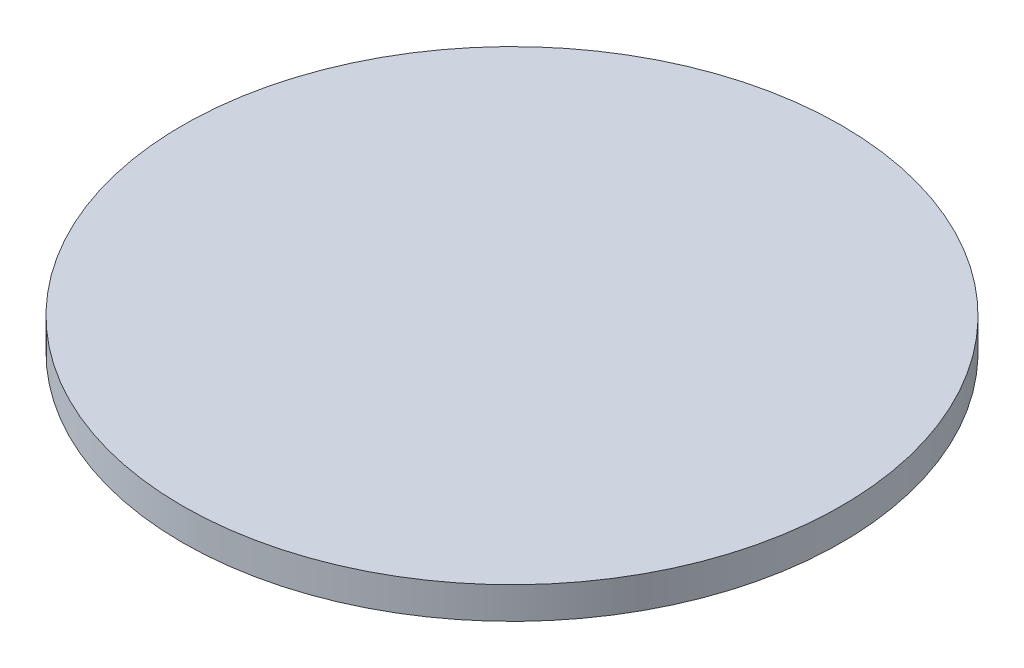
ISO-10303-21;
HEADER;
FILE_DESCRIPTION(('STEP AP214'),'2;1');
FILE_NAME('part.step','',(''),(''),'','','');
FILE_SCHEMA(('AUTOMOTIVE_DESIGN { 1 0 10303 214 1 1 1 1 }'));
ENDSEC;
DATA;
#1=APPLICATION_CONTEXT('core data for automotive mechanical design processes');
#2=APPLICATION_PROTOCOL_DEFINITION('international standard','automotive_design',2000,#1);
#3=PRODUCT_CONTEXT('',#1,'mechanical');
#4=PRODUCT('Part','Part','',(#3));
#5=PRODUCT_RELATED_PRODUCT_CATEGORY('part','',(#4));
#6=PRODUCT_DEFINITION_FORMATION('','',#4);
#7=PRODUCT_DEFINITION_CONTEXT('part definition',#1,'design');
#8=PRODUCT_DEFINITION('design','',#6,#7);
#9=PRODUCT_DEFINITION_SHAPE('','',#8);
#10=(LENGTH_UNIT() NAMED_UNIT(*) SI_UNIT(.MILLI.,.METRE.));
#11=(NAMED_UNIT(*) PLANE_ANGLE_UNIT() SI_UNIT($,.RADIAN.));
#12=(NAMED_UNIT(*) SI_UNIT($,.STERADIAN.) SOLID_ANGLE_UNIT());
#13=UNCERTAINTY_MEASURE_WITH_UNIT(LENGTH_MEASURE(1.E-05),#10,'distance_accuracy_value','');
#14=(GEOMETRIC_REPRESENTATION_CONTEXT(3) GLOBAL_UNCERTAINTY_ASSIGNED_CONTEXT((#13)) GLOBAL_UNIT_ASSIGNED_CONTEXT((#10,
#11,#12)) REPRESENTATION_CONTEXT('',''));
#15=CARTESIAN_POINT('',(0.,0.,0.));
#16=DIRECTION('',(0.,0.,1.));
#17=DIRECTION('',(1.,0.,0.));
#18=AXIS2_PLACEMENT_3D('',#15,#16,#17);
#19=CARTESIAN_POINT('',(0.,1.,0.));
#20=DIRECTION('',(0.,-1.,0.));
#21=DIRECTION('',(0.,0.,-1.));
#22=AXIS2_PLACEMENT_3D('',#19,#20,#21);
#23=CYLINDRICAL_SURFACE('',#22,10.375);
#24=CARTESIAN_POINT('',(0.,1.,0.));
#25=DIRECTION('',(0.,1.,0.));
#26=DIRECTION('',(0.,0.,1.));
#27=AXIS2_PLACEMENT_3D('',#24,#25,#26);
#28=CIRCLE('',#27,10.375);
#29=CARTESIAN_POINT('',(0.,1.,10.375));
#30=VERTEX_POINT('',#29);
#31=EDGE_CURVE('E10',#30,#30,#28,.T.);
#32=ORIENTED_EDGE('',*,*,#31,.F.);
#33=EDGE_LOOP('',(#32));
#34=FACE_BOUND('',#33,.T.);
#35=CARTESIAN_POINT('',(0.,0.,0.));
#36=DIRECTION('',(0.,1.,0.));
#37=DIRECTION('',(0.,0.,1.));
#38=AXIS2_PLACEMENT_3D('',#35,#36,#37);
#39=CIRCLE('',#38,10.375);
#40=CARTESIAN_POINT('',(0.,0.,10.375));
#41=VERTEX_POINT('',#40);
#42=EDGE_CURVE('E40',#41,#41,#39,.T.);
#43=ORIENTED_EDGE('',*,*,#42,.T.);
#44=EDGE_LOOP('',(#43));
#45=FACE_BOUND('',#44,.T.);
#46=ADVANCED_FACE('F37',(#34,#45),#23,.T.);
#47=CARTESIAN_POINT('',(0.,1.,0.));
#48=DIRECTION('',(0.,1.,0.));
#49=DIRECTION('',(0.,0.,1.));
#50=AXIS2_PLACEMENT_3D('',#47,#48,#49);
#51=PLANE('',#50);
#52=ORIENTED_EDGE('',*,*,#31,.T.);
#53=EDGE_LOOP('',(#52));
#54=FACE_BOUND('',#53,.T.);
#55=ADVANCED_FACE('F54',(#54),#51,.T.);
#56=CARTESIAN_POINT('',(0.,0.,0.));
#57=DIRECTION('',(0.,1.,0.));
#58=DIRECTION('',(0.,0.,1.));
#59=AXIS2_PLACEMENT_3D('',#56,#57,#58);
#60=PLANE('',#59);
#61=ORIENTED_EDGE('',*,*,#42,.F.);
#62=EDGE_LOOP('',(#61));
#63=FACE_BOUND('',#62,.T.);
#64=ADVANCED_FACE('F52',(#63),#60,.F.);
#65=CLOSED_SHELL('',(#46,#55,#64));
#66=MANIFOLD_SOLID_BREP('B2',#65);
#67=ADVANCED_BREP_SHAPE_REPRESENTATION('',(#18,#66),#14);
#68=SHAPE_DEFINITION_REPRESENTATION(#9,#67);
ENDSEC;
END-ISO-10303-21;
